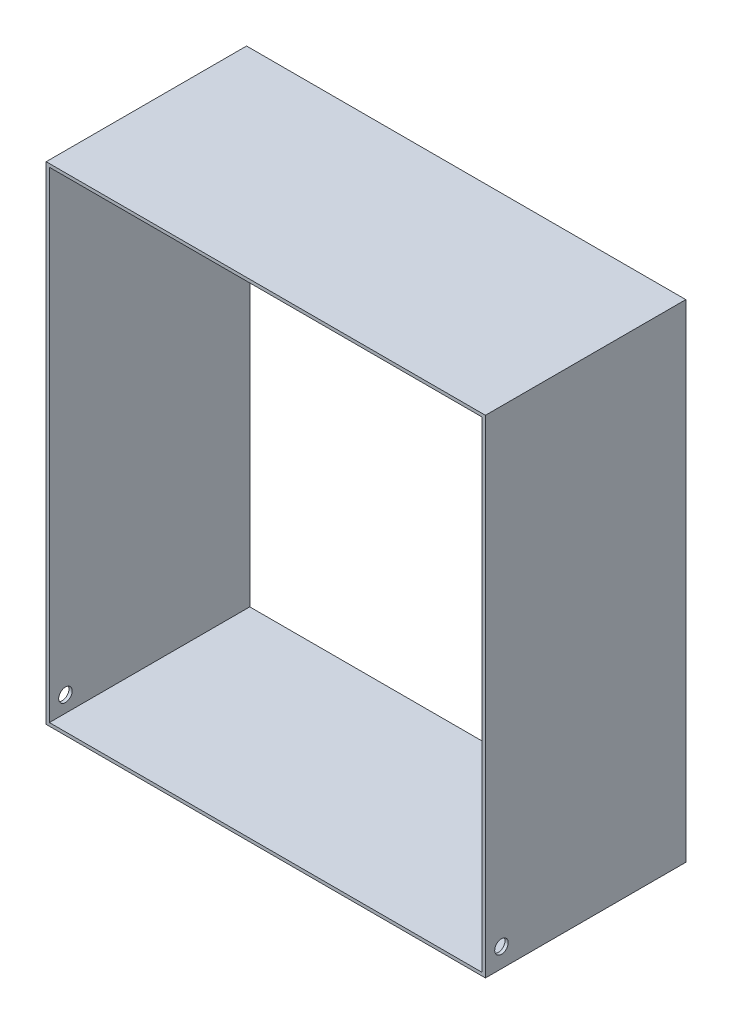
ISO-10303-21;
HEADER;
FILE_DESCRIPTION(('STEP AP214'),'2;1');
FILE_NAME('part.step','',(''),(''),'','','');
FILE_SCHEMA(('AUTOMOTIVE_DESIGN { 1 0 10303 214 1 1 1 1 }'));
ENDSEC;
DATA;
#1=APPLICATION_CONTEXT('core data for automotive mechanical design processes');
#2=APPLICATION_PROTOCOL_DEFINITION('international standard','automotive_design',2000,#1);
#3=PRODUCT_CONTEXT('',#1,'mechanical');
#4=PRODUCT('Part','Part','',(#3));
#5=PRODUCT_RELATED_PRODUCT_CATEGORY('part','',(#4));
#6=PRODUCT_DEFINITION_FORMATION('','',#4);
#7=PRODUCT_DEFINITION_CONTEXT('part definition',#1,'design');
#8=PRODUCT_DEFINITION('design','',#6,#7);
#9=PRODUCT_DEFINITION_SHAPE('','',#8);
#10=(LENGTH_UNIT() NAMED_UNIT(*) SI_UNIT(.MILLI.,.METRE.));
#11=(NAMED_UNIT(*) PLANE_ANGLE_UNIT() SI_UNIT($,.RADIAN.));
#12=(NAMED_UNIT(*) SI_UNIT($,.STERADIAN.) SOLID_ANGLE_UNIT());
#13=UNCERTAINTY_MEASURE_WITH_UNIT(LENGTH_MEASURE(1.E-05),#10,'distance_accuracy_value','');
#14=(GEOMETRIC_REPRESENTATION_CONTEXT(3) GLOBAL_UNCERTAINTY_ASSIGNED_CONTEXT((#13)) GLOBAL_UNIT_ASSIGNED_CONTEXT((#10,
#11,#12)) REPRESENTATION_CONTEXT('',''));
#15=CARTESIAN_POINT('',(0.,0.,0.));
#16=DIRECTION('',(0.,0.,1.));
#17=DIRECTION('',(1.,0.,0.));
#18=AXIS2_PLACEMENT_3D('',#15,#16,#17);
#19=CARTESIAN_POINT('',(0.,-2.,-125.));
#20=DIRECTION('',(0.,-1.,0.));
#21=DIRECTION('',(0.,0.,-1.));
#22=AXIS2_PLACEMENT_3D('',#19,#20,#21);
#23=PLANE('',#22);
#24=DIRECTION('',(1.,0.,0.));
#25=VECTOR('',#24,1.);
#26=CARTESIAN_POINT('',(0.,-2.,0.));
#27=LINE('',#26,#25);
#28=CARTESIAN_POINT('',(-2.,-2.,0.));
#29=VERTEX_POINT('',#28);
#30=CARTESIAN_POINT('',(272.,-2.,0.));
#31=VERTEX_POINT('',#30);
#32=EDGE_CURVE('E164',#29,#31,#27,.T.);
#33=ORIENTED_EDGE('',*,*,#32,.F.);
#34=DIRECTION('',(0.,0.,1.));
#35=VECTOR('',#34,1.);
#36=CARTESIAN_POINT('',(-2.,-2.,-125.));
#37=LINE('',#36,#35);
#38=CARTESIAN_POINT('',(-2.,-2.,-125.));
#39=VERTEX_POINT('',#38);
#40=EDGE_CURVE('E11',#39,#29,#37,.T.);
#41=ORIENTED_EDGE('',*,*,#40,.F.);
#42=DIRECTION('',(1.,0.,0.));
#43=VECTOR('',#42,1.);
#44=CARTESIAN_POINT('',(272.,-2.,-125.));
#45=LINE('',#44,#43);
#46=CARTESIAN_POINT('',(272.,-2.,-125.));
#47=VERTEX_POINT('',#46);
#48=EDGE_CURVE('E159',#39,#47,#45,.T.);
#49=ORIENTED_EDGE('',*,*,#48,.T.);
#50=DIRECTION('',(0.,0.,1.));
#51=VECTOR('',#50,1.);
#52=CARTESIAN_POINT('',(272.,-2.,-125.));
#53=LINE('',#52,#51);
#54=EDGE_CURVE('E173',#47,#31,#53,.T.);
#55=ORIENTED_EDGE('',*,*,#54,.T.);
#56=EDGE_LOOP('',(#33,#41,#49,#55));
#57=FACE_BOUND('',#56,.T.);
#58=ADVANCED_FACE('F39',(#57),#23,.T.);
#59=CARTESIAN_POINT('',(-2.,0.,-125.));
#60=DIRECTION('',(-1.,0.,0.));
#61=DIRECTION('',(0.,0.,1.));
#62=AXIS2_PLACEMENT_3D('',#59,#60,#61);
#63=PLANE('',#62);
#64=CARTESIAN_POINT('',(-2.,10.,-10.));
#65=DIRECTION('',(-1.,0.,0.));
#66=DIRECTION('',(0.,0.,1.));
#67=AXIS2_PLACEMENT_3D('',#64,#65,#66);
#68=CIRCLE('',#67,4.2);
#69=CARTESIAN_POINT('',(-2.,10.,-5.8));
#70=VERTEX_POINT('',#69);
#71=EDGE_CURVE('E135',#70,#70,#68,.T.);
#72=ORIENTED_EDGE('',*,*,#71,.F.);
#73=EDGE_LOOP('',(#72));
#74=FACE_BOUND('',#73,.T.);
#75=DIRECTION('',(0.,-1.,0.));
#76=VECTOR('',#75,1.);
#77=CARTESIAN_POINT('',(-2.,0.,0.));
#78=LINE('',#77,#76);
#79=CARTESIAN_POINT('',(-2.,302.,0.));
#80=VERTEX_POINT('',#79);
#81=EDGE_CURVE('E181',#80,#29,#78,.T.);
#82=ORIENTED_EDGE('',*,*,#81,.F.);
#83=DIRECTION('',(0.,0.,1.));
#84=VECTOR('',#83,1.);
#85=CARTESIAN_POINT('',(-2.,302.,-125.));
#86=LINE('',#85,#84);
#87=CARTESIAN_POINT('',(-2.,302.,-125.));
#88=VERTEX_POINT('',#87);
#89=EDGE_CURVE('E49',#88,#80,#86,.T.);
#90=ORIENTED_EDGE('',*,*,#89,.F.);
#91=DIRECTION('',(0.,-1.,0.));
#92=VECTOR('',#91,1.);
#93=CARTESIAN_POINT('',(-2.,302.,-125.));
#94=LINE('',#93,#92);
#95=EDGE_CURVE('E170',#88,#39,#94,.T.);
#96=ORIENTED_EDGE('',*,*,#95,.T.);
#97=ORIENTED_EDGE('',*,*,#40,.T.);
#98=EDGE_LOOP('',(#82,#90,#96,#97));
#99=FACE_BOUND('',#98,.T.);
#100=ADVANCED_FACE('F208',(#74,#99),#63,.T.);
#101=CARTESIAN_POINT('',(0.,302.,-125.));
#102=DIRECTION('',(0.,1.,0.));
#103=DIRECTION('',(0.,0.,1.));
#104=AXIS2_PLACEMENT_3D('',#101,#102,#103);
#105=PLANE('',#104);
#106=DIRECTION('',(-1.,0.,0.));
#107=VECTOR('',#106,1.);
#108=CARTESIAN_POINT('',(0.,302.,0.));
#109=LINE('',#108,#107);
#110=CARTESIAN_POINT('',(272.,302.,0.));
#111=VERTEX_POINT('',#110);
#112=EDGE_CURVE('E177',#111,#80,#109,.T.);
#113=ORIENTED_EDGE('',*,*,#112,.F.);
#114=DIRECTION('',(0.,0.,1.));
#115=VECTOR('',#114,1.);
#116=CARTESIAN_POINT('',(272.,302.,-125.));
#117=LINE('',#116,#115);
#118=CARTESIAN_POINT('',(272.,302.,-125.));
#119=VERTEX_POINT('',#118);
#120=EDGE_CURVE('E191',#119,#111,#117,.T.);
#121=ORIENTED_EDGE('',*,*,#120,.F.);
#122=DIRECTION('',(-1.,0.,0.));
#123=VECTOR('',#122,1.);
#124=CARTESIAN_POINT('',(270.,302.,-125.));
#125=LINE('',#124,#123);
#126=EDGE_CURVE('E167',#119,#88,#125,.T.);
#127=ORIENTED_EDGE('',*,*,#126,.T.);
#128=ORIENTED_EDGE('',*,*,#89,.T.);
#129=EDGE_LOOP('',(#113,#121,#127,#128));
#130=FACE_BOUND('',#129,.T.);
#131=ADVANCED_FACE('F206',(#130),#105,.T.);
#132=CARTESIAN_POINT('',(272.,302.,-125.));
#133=DIRECTION('',(1.,0.,0.));
#134=DIRECTION('',(0.,0.,-1.));
#135=AXIS2_PLACEMENT_3D('',#132,#133,#134);
#136=PLANE('',#135);
#137=CARTESIAN_POINT('',(272.,10.,-10.));
#138=DIRECTION('',(1.,0.,0.));
#139=DIRECTION('',(0.,0.,-1.));
#140=AXIS2_PLACEMENT_3D('',#137,#138,#139);
#141=CIRCLE('',#140,4.2);
#142=CARTESIAN_POINT('',(272.,10.,-14.2));
#143=VERTEX_POINT('',#142);
#144=EDGE_CURVE('E238',#143,#143,#141,.T.);
#145=ORIENTED_EDGE('',*,*,#144,.F.);
#146=EDGE_LOOP('',(#145));
#147=FACE_BOUND('',#146,.T.);
#148=DIRECTION('',(0.,1.,0.));
#149=VECTOR('',#148,1.);
#150=CARTESIAN_POINT('',(272.,302.,0.));
#151=LINE('',#150,#149);
#152=EDGE_CURVE('E153',#31,#111,#151,.T.);
#153=ORIENTED_EDGE('',*,*,#152,.F.);
#154=ORIENTED_EDGE('',*,*,#54,.F.);
#155=DIRECTION('',(0.,1.,0.));
#156=VECTOR('',#155,1.);
#157=CARTESIAN_POINT('',(272.,0.,-125.));
#158=LINE('',#157,#156);
#159=EDGE_CURVE('E163',#47,#119,#158,.T.);
#160=ORIENTED_EDGE('',*,*,#159,.T.);
#161=ORIENTED_EDGE('',*,*,#120,.T.);
#162=EDGE_LOOP('',(#153,#154,#160,#161));
#163=FACE_BOUND('',#162,.T.);
#164=ADVANCED_FACE('F41',(#147,#163),#136,.T.);
#165=CARTESIAN_POINT('',(0.,0.,-125.));
#166=DIRECTION('',(0.,0.,1.));
#167=DIRECTION('',(1.,0.,0.));
#168=AXIS2_PLACEMENT_3D('',#165,#166,#167);
#169=PLANE('',#168);
#170=DIRECTION('',(-1.,0.,0.));
#171=VECTOR('',#170,1.);
#172=CARTESIAN_POINT('',(0.,300.,-125.));
#173=LINE('',#172,#171);
#174=CARTESIAN_POINT('',(270.,300.,-125.));
#175=VERTEX_POINT('',#174);
#176=CARTESIAN_POINT('',(0.,300.,-125.));
#177=VERTEX_POINT('',#176);
#178=EDGE_CURVE('E116',#175,#177,#173,.T.);
#179=ORIENTED_EDGE('',*,*,#178,.T.);
#180=DIRECTION('',(0.,-1.,0.));
#181=VECTOR('',#180,1.);
#182=CARTESIAN_POINT('',(0.,0.,-125.));
#183=LINE('',#182,#181);
#184=CARTESIAN_POINT('',(0.,0.,-125.));
#185=VERTEX_POINT('',#184);
#186=EDGE_CURVE('E109',#177,#185,#183,.T.);
#187=ORIENTED_EDGE('',*,*,#186,.T.);
#188=DIRECTION('',(1.,0.,0.));
#189=VECTOR('',#188,1.);
#190=CARTESIAN_POINT('',(0.,0.,-125.));
#191=LINE('',#190,#189);
#192=CARTESIAN_POINT('',(270.,0.,-125.));
#193=VERTEX_POINT('',#192);
#194=EDGE_CURVE('E119',#185,#193,#191,.T.);
#195=ORIENTED_EDGE('',*,*,#194,.T.);
#196=DIRECTION('',(0.,1.,0.));
#197=VECTOR('',#196,1.);
#198=CARTESIAN_POINT('',(270.,0.,-125.));
#199=LINE('',#198,#197);
#200=EDGE_CURVE('E57',#193,#175,#199,.T.);
#201=ORIENTED_EDGE('',*,*,#200,.T.);
#202=EDGE_LOOP('',(#179,#187,#195,#201));
#203=FACE_BOUND('',#202,.T.);
#204=ORIENTED_EDGE('',*,*,#48,.F.);
#205=ORIENTED_EDGE('',*,*,#95,.F.);
#206=ORIENTED_EDGE('',*,*,#126,.F.);
#207=ORIENTED_EDGE('',*,*,#159,.F.);
#208=EDGE_LOOP('',(#204,#205,#206,#207));
#209=FACE_BOUND('',#208,.T.);
#210=ADVANCED_FACE('F124',(#203,#209),#169,.F.);
#211=CARTESIAN_POINT('',(0.,0.,0.));
#212=DIRECTION('',(0.,0.,1.));
#213=DIRECTION('',(1.,0.,0.));
#214=AXIS2_PLACEMENT_3D('',#211,#212,#213);
#215=PLANE('',#214);
#216=DIRECTION('',(0.,-1.,0.));
#217=VECTOR('',#216,1.);
#218=CARTESIAN_POINT('',(0.,0.,0.));
#219=LINE('',#218,#217);
#220=CARTESIAN_POINT('',(0.,300.,0.));
#221=VERTEX_POINT('',#220);
#222=CARTESIAN_POINT('',(0.,0.,0.));
#223=VERTEX_POINT('',#222);
#224=EDGE_CURVE('E65',#221,#223,#219,.T.);
#225=ORIENTED_EDGE('',*,*,#224,.F.);
#226=DIRECTION('',(-1.,0.,0.));
#227=VECTOR('',#226,1.);
#228=CARTESIAN_POINT('',(0.,300.,0.));
#229=LINE('',#228,#227);
#230=CARTESIAN_POINT('',(270.,300.,0.));
#231=VERTEX_POINT('',#230);
#232=EDGE_CURVE('E128',#231,#221,#229,.T.);
#233=ORIENTED_EDGE('',*,*,#232,.F.);
#234=DIRECTION('',(0.,1.,0.));
#235=VECTOR('',#234,1.);
#236=CARTESIAN_POINT('',(270.,0.,0.));
#237=LINE('',#236,#235);
#238=CARTESIAN_POINT('',(270.,0.,0.));
#239=VERTEX_POINT('',#238);
#240=EDGE_CURVE('E132',#239,#231,#237,.T.);
#241=ORIENTED_EDGE('',*,*,#240,.F.);
#242=DIRECTION('',(1.,0.,0.));
#243=VECTOR('',#242,1.);
#244=CARTESIAN_POINT('',(0.,0.,0.));
#245=LINE('',#244,#243);
#246=EDGE_CURVE('E144',#223,#239,#245,.T.);
#247=ORIENTED_EDGE('',*,*,#246,.F.);
#248=EDGE_LOOP('',(#225,#233,#241,#247));
#249=FACE_BOUND('',#248,.T.);
#250=ORIENTED_EDGE('',*,*,#32,.T.);
#251=ORIENTED_EDGE('',*,*,#152,.T.);
#252=ORIENTED_EDGE('',*,*,#112,.T.);
#253=ORIENTED_EDGE('',*,*,#81,.T.);
#254=EDGE_LOOP('',(#250,#251,#252,#253));
#255=FACE_BOUND('',#254,.T.);
#256=ADVANCED_FACE('F210',(#249,#255),#215,.T.);
#257=CARTESIAN_POINT('',(0.,0.,-125.));
#258=DIRECTION('',(-1.,0.,0.));
#259=DIRECTION('',(0.,0.,1.));
#260=AXIS2_PLACEMENT_3D('',#257,#258,#259);
#261=PLANE('',#260);
#262=CARTESIAN_POINT('',(0.,10.,-10.));
#263=DIRECTION('',(-1.,0.,0.));
#264=DIRECTION('',(0.,0.,1.));
#265=AXIS2_PLACEMENT_3D('',#262,#263,#264);
#266=CIRCLE('',#265,4.2);
#267=CARTESIAN_POINT('',(0.,10.,-5.8));
#268=VERTEX_POINT('',#267);
#269=EDGE_CURVE('E244',#268,#268,#266,.T.);
#270=ORIENTED_EDGE('',*,*,#269,.T.);
#271=EDGE_LOOP('',(#270));
#272=FACE_BOUND('',#271,.T.);
#273=ORIENTED_EDGE('',*,*,#224,.T.);
#274=DIRECTION('',(0.,0.,1.));
#275=VECTOR('',#274,1.);
#276=CARTESIAN_POINT('',(0.,0.,-125.));
#277=LINE('',#276,#275);
#278=EDGE_CURVE('E105',#185,#223,#277,.T.);
#279=ORIENTED_EDGE('',*,*,#278,.F.);
#280=ORIENTED_EDGE('',*,*,#186,.F.);
#281=DIRECTION('',(0.,0.,1.));
#282=VECTOR('',#281,1.);
#283=CARTESIAN_POINT('',(0.,300.,-125.));
#284=LINE('',#283,#282);
#285=EDGE_CURVE('E150',#177,#221,#284,.T.);
#286=ORIENTED_EDGE('',*,*,#285,.T.);
#287=EDGE_LOOP('',(#273,#279,#280,#286));
#288=FACE_BOUND('',#287,.T.);
#289=ADVANCED_FACE('F107',(#272,#288),#261,.F.);
#290=CARTESIAN_POINT('',(0.,300.,-125.));
#291=DIRECTION('',(0.,1.,0.));
#292=DIRECTION('',(0.,0.,1.));
#293=AXIS2_PLACEMENT_3D('',#290,#291,#292);
#294=PLANE('',#293);
#295=ORIENTED_EDGE('',*,*,#232,.T.);
#296=ORIENTED_EDGE('',*,*,#285,.F.);
#297=ORIENTED_EDGE('',*,*,#178,.F.);
#298=DIRECTION('',(0.,0.,1.));
#299=VECTOR('',#298,1.);
#300=CARTESIAN_POINT('',(270.,300.,-125.));
#301=LINE('',#300,#299);
#302=EDGE_CURVE('E154',#175,#231,#301,.T.);
#303=ORIENTED_EDGE('',*,*,#302,.T.);
#304=EDGE_LOOP('',(#295,#296,#297,#303));
#305=FACE_BOUND('',#304,.T.);
#306=ADVANCED_FACE('F218',(#305),#294,.F.);
#307=CARTESIAN_POINT('',(270.,0.,-125.));
#308=DIRECTION('',(1.,0.,0.));
#309=DIRECTION('',(0.,0.,-1.));
#310=AXIS2_PLACEMENT_3D('',#307,#308,#309);
#311=PLANE('',#310);
#312=CARTESIAN_POINT('',(270.,10.,-10.));
#313=DIRECTION('',(1.,0.,0.));
#314=DIRECTION('',(0.,0.,-1.));
#315=AXIS2_PLACEMENT_3D('',#312,#313,#314);
#316=CIRCLE('',#315,4.2);
#317=CARTESIAN_POINT('',(270.,10.,-14.2));
#318=VERTEX_POINT('',#317);
#319=EDGE_CURVE('E43',#318,#318,#316,.T.);
#320=ORIENTED_EDGE('',*,*,#319,.T.);
#321=EDGE_LOOP('',(#320));
#322=FACE_BOUND('',#321,.T.);
#323=ORIENTED_EDGE('',*,*,#240,.T.);
#324=ORIENTED_EDGE('',*,*,#302,.F.);
#325=ORIENTED_EDGE('',*,*,#200,.F.);
#326=DIRECTION('',(0.,0.,1.));
#327=VECTOR('',#326,1.);
#328=CARTESIAN_POINT('',(270.,0.,-125.));
#329=LINE('',#328,#327);
#330=EDGE_CURVE('E115',#193,#239,#329,.T.);
#331=ORIENTED_EDGE('',*,*,#330,.T.);
#332=EDGE_LOOP('',(#323,#324,#325,#331));
#333=FACE_BOUND('',#332,.T.);
#334=ADVANCED_FACE('F263',(#322,#333),#311,.F.);
#335=CARTESIAN_POINT('',(0.,0.,-125.));
#336=DIRECTION('',(0.,-1.,0.));
#337=DIRECTION('',(0.,0.,-1.));
#338=AXIS2_PLACEMENT_3D('',#335,#336,#337);
#339=PLANE('',#338);
#340=ORIENTED_EDGE('',*,*,#246,.T.);
#341=ORIENTED_EDGE('',*,*,#330,.F.);
#342=ORIENTED_EDGE('',*,*,#194,.F.);
#343=ORIENTED_EDGE('',*,*,#278,.T.);
#344=EDGE_LOOP('',(#340,#341,#342,#343));
#345=FACE_BOUND('',#344,.T.);
#346=ADVANCED_FACE('F120',(#345),#339,.F.);
#347=CARTESIAN_POINT('',(-27.,10.,-10.));
#348=DIRECTION('',(1.,0.,0.));
#349=DIRECTION('',(0.,0.,-1.));
#350=AXIS2_PLACEMENT_3D('',#347,#348,#349);
#351=CYLINDRICAL_SURFACE('',#350,4.2);
#352=ORIENTED_EDGE('',*,*,#144,.T.);
#353=EDGE_LOOP('',(#352));
#354=FACE_BOUND('',#353,.T.);
#355=ORIENTED_EDGE('',*,*,#319,.F.);
#356=EDGE_LOOP('',(#355));
#357=FACE_BOUND('',#356,.T.);
#358=ADVANCED_FACE('F255',(#354,#357),#351,.F.);
#359=ORIENTED_EDGE('',*,*,#71,.T.);
#360=EDGE_LOOP('',(#359));
#361=FACE_BOUND('',#360,.T.);
#362=ORIENTED_EDGE('',*,*,#269,.F.);
#363=EDGE_LOOP('',(#362));
#364=FACE_BOUND('',#363,.T.);
#365=ADVANCED_FACE('F252',(#361,#364),#351,.F.);
#366=CLOSED_SHELL('',(#58,#100,#131,#164,#210,#256,#289,#306,#334,#346,#358,#365));
#367=MANIFOLD_SOLID_BREP('B2',#366);
#368=ADVANCED_BREP_SHAPE_REPRESENTATION('',(#18,#367),#14);
#369=SHAPE_DEFINITION_REPRESENTATION(#9,#368);
ENDSEC;
END-ISO-10303-21;
